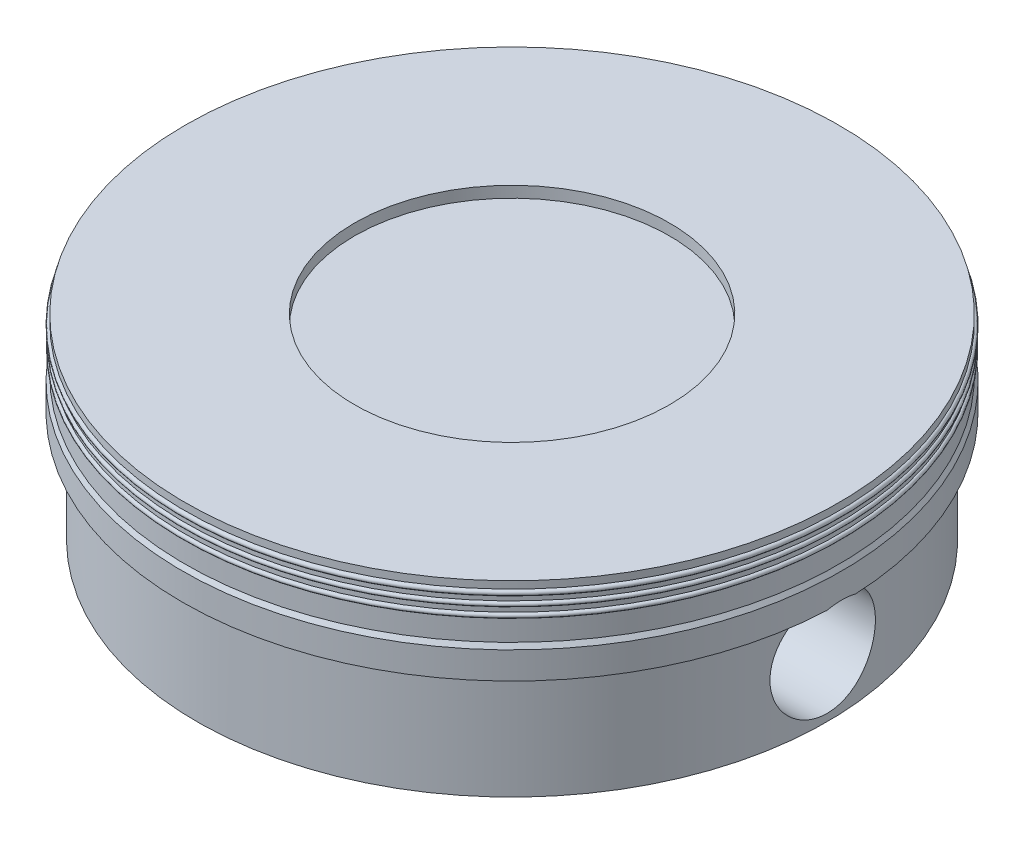
ISO-10303-21;
HEADER;
FILE_DESCRIPTION(('STEP AP214'),'2;1');
FILE_NAME('part.step','',(''),(''),'','','');
FILE_SCHEMA(('AUTOMOTIVE_DESIGN { 1 0 10303 214 1 1 1 1 }'));
ENDSEC;
DATA;
#1=APPLICATION_CONTEXT('core data for automotive mechanical design processes');
#2=APPLICATION_PROTOCOL_DEFINITION('international standard','automotive_design',2000,#1);
#3=PRODUCT_CONTEXT('',#1,'mechanical');
#4=PRODUCT('Part','Part','',(#3));
#5=PRODUCT_RELATED_PRODUCT_CATEGORY('part','',(#4));
#6=PRODUCT_DEFINITION_FORMATION('','',#4);
#7=PRODUCT_DEFINITION_CONTEXT('part definition',#1,'design');
#8=PRODUCT_DEFINITION('design','',#6,#7);
#9=PRODUCT_DEFINITION_SHAPE('','',#8);
#10=(LENGTH_UNIT() NAMED_UNIT(*) SI_UNIT(.MILLI.,.METRE.));
#11=(NAMED_UNIT(*) PLANE_ANGLE_UNIT() SI_UNIT($,.RADIAN.));
#12=(NAMED_UNIT(*) SI_UNIT($,.STERADIAN.) SOLID_ANGLE_UNIT());
#13=UNCERTAINTY_MEASURE_WITH_UNIT(LENGTH_MEASURE(1.E-05),#10,'distance_accuracy_value','');
#14=(GEOMETRIC_REPRESENTATION_CONTEXT(3) GLOBAL_UNCERTAINTY_ASSIGNED_CONTEXT((#13)) GLOBAL_UNIT_ASSIGNED_CONTEXT((#10,
#11,#12)) REPRESENTATION_CONTEXT('',''));
#15=CARTESIAN_POINT('',(0.,0.,0.));
#16=DIRECTION('',(0.,0.,1.));
#17=DIRECTION('',(1.,0.,0.));
#18=AXIS2_PLACEMENT_3D('',#15,#16,#17);
#19=CARTESIAN_POINT('',(5.,1.68,0.));
#20=DIRECTION('',(0.,1.,0.));
#21=DIRECTION('',(-1.,0.,0.));
#22=AXIS2_PLACEMENT_3D('',#19,#20,#21);
#23=PLANE('',#22);
#24=CARTESIAN_POINT('',(0.,1.68000000000002,0.));
#25=DIRECTION('',(0.,1.,0.));
#26=DIRECTION('',(-1.,0.,0.));
#27=AXIS2_PLACEMENT_3D('',#24,#25,#26);
#28=CIRCLE('',#27,5.);
#29=CARTESIAN_POINT('',(-4.99528777949779,1.68000000000003,0.217025344142001));
#30=VERTEX_POINT('',#29);
#31=CARTESIAN_POINT('',(4.9952877794978,1.68000000000002,0.217025344142001));
#32=VERTEX_POINT('',#31);
#33=EDGE_CURVE('E131',#30,#32,#28,.T.);
#34=ORIENTED_EDGE('',*,*,#33,.F.);
#35=DIRECTION('',(1.,0.,0.));
#36=VECTOR('',#35,1.);
#37=CARTESIAN_POINT('',(-5.00031358215678,1.68000000000003,0.217025344142002));
#38=LINE('',#37,#36);
#39=CARTESIAN_POINT('',(-4.77507068010516,1.68000000000001,0.217025344142002));
#40=VERTEX_POINT('',#39);
#41=EDGE_CURVE('E59',#30,#40,#38,.T.);
#42=ORIENTED_EDGE('',*,*,#41,.T.);
#43=CARTESIAN_POINT('',(0.,1.68000000000001,0.));
#44=DIRECTION('',(0.,1.,0.));
#45=DIRECTION('',(-1.,0.,0.));
#46=AXIS2_PLACEMENT_3D('',#43,#44,#45);
#47=CIRCLE('',#46,4.78);
#48=CARTESIAN_POINT('',(4.77507068010517,1.68000000000001,0.217025344142002));
#49=VERTEX_POINT('',#48);
#50=EDGE_CURVE('E139',#40,#49,#47,.T.);
#51=ORIENTED_EDGE('',*,*,#50,.T.);
#52=EDGE_CURVE('E259',#49,#32,#38,.T.);
#53=ORIENTED_EDGE('',*,*,#52,.T.);
#54=EDGE_LOOP('',(#34,#42,#51,#53));
#55=FACE_BOUND('',#54,.T.);
#56=ADVANCED_FACE('F35',(#55),#23,.F.);
#57=CARTESIAN_POINT('',(0.,3.,0.));
#58=DIRECTION('',(0.,1.,0.));
#59=DIRECTION('',(-1.,0.,0.));
#60=AXIS2_PLACEMENT_3D('',#57,#58,#59);
#61=CYLINDRICAL_SURFACE('',#60,3.43);
#62=CARTESIAN_POINT('',(0.,1.93000000000001,0.));
#63=DIRECTION('',(0.,1.,0.));
#64=DIRECTION('',(-1.,0.,0.));
#65=AXIS2_PLACEMENT_3D('',#62,#63,#64);
#66=CIRCLE('',#65,3.42999999999999);
#67=CARTESIAN_POINT('',(-1.74999999999999,1.93000000000002,2.94998305079876));
#68=VERTEX_POINT('',#67);
#69=CARTESIAN_POINT('',(1.75,1.93000000000002,2.94998305079877));
#70=VERTEX_POINT('',#69);
#71=EDGE_CURVE('E173',#68,#70,#66,.T.);
#72=ORIENTED_EDGE('',*,*,#71,.T.);
#73=DIRECTION('',(0.,1.,0.));
#74=VECTOR('',#73,1.);
#75=CARTESIAN_POINT('',(1.75000000000001,3.,2.94998305079876));
#76=LINE('',#75,#74);
#77=CARTESIAN_POINT('',(1.75,0.,2.94998305079877));
#78=VERTEX_POINT('',#77);
#79=EDGE_CURVE('E11',#70,#78,#76,.F.);
#80=ORIENTED_EDGE('',*,*,#79,.T.);
#81=CARTESIAN_POINT('',(0.,0.,0.));
#82=DIRECTION('',(0.,1.,0.));
#83=DIRECTION('',(-1.,0.,0.));
#84=AXIS2_PLACEMENT_3D('',#81,#82,#83);
#85=CIRCLE('',#84,3.43);
#86=CARTESIAN_POINT('',(-1.75,0.,2.94998305079877));
#87=VERTEX_POINT('',#86);
#88=EDGE_CURVE('E174',#87,#78,#85,.T.);
#89=ORIENTED_EDGE('',*,*,#88,.F.);
#90=DIRECTION('',(0.,1.,0.));
#91=VECTOR('',#90,1.);
#92=CARTESIAN_POINT('',(-1.74999999999999,3.00000000000001,2.94998305079876));
#93=LINE('',#92,#91);
#94=EDGE_CURVE('E145',#87,#68,#93,.T.);
#95=ORIENTED_EDGE('',*,*,#94,.T.);
#96=EDGE_LOOP('',(#72,#80,#89,#95));
#97=FACE_BOUND('',#96,.T.);
#98=ADVANCED_FACE('F231',(#97),#61,.F.);
#99=CARTESIAN_POINT('',(4.78,0.,0.));
#100=DIRECTION('',(0.,1.,0.));
#101=DIRECTION('',(-1.,0.,0.));
#102=AXIS2_PLACEMENT_3D('',#99,#100,#101);
#103=PLANE('',#102);
#104=CARTESIAN_POINT('',(0.,0.,0.));
#105=DIRECTION('',(0.,1.,0.));
#106=DIRECTION('',(-1.,0.,0.));
#107=AXIS2_PLACEMENT_3D('',#104,#105,#106);
#108=CIRCLE('',#107,4.78);
#109=CARTESIAN_POINT('',(-4.78,0.,0.));
#110=VERTEX_POINT('',#109);
#111=EDGE_CURVE('E142',#110,#110,#108,.T.);
#112=ORIENTED_EDGE('',*,*,#111,.F.);
#113=EDGE_LOOP('',(#112));
#114=FACE_BOUND('',#113,.T.);
#115=ORIENTED_EDGE('',*,*,#88,.T.);
#116=DIRECTION('',(0.,0.,-1.));
#117=VECTOR('',#116,1.);
#118=CARTESIAN_POINT('',(1.75,0.,2.94998305079877));
#119=LINE('',#118,#117);
#120=CARTESIAN_POINT('',(1.75,0.,-2.94998305079877));
#121=VERTEX_POINT('',#120);
#122=EDGE_CURVE('E258',#78,#121,#119,.T.);
#123=ORIENTED_EDGE('',*,*,#122,.T.);
#124=CARTESIAN_POINT('',(-1.75,0.,-2.94998305079877));
#125=VERTEX_POINT('',#124);
#126=EDGE_CURVE('E158',#121,#125,#85,.T.);
#127=ORIENTED_EDGE('',*,*,#126,.T.);
#128=DIRECTION('',(0.,0.,1.));
#129=VECTOR('',#128,1.);
#130=CARTESIAN_POINT('',(-1.75,0.,2.94998305079877));
#131=LINE('',#130,#129);
#132=EDGE_CURVE('E292',#125,#87,#131,.T.);
#133=ORIENTED_EDGE('',*,*,#132,.T.);
#134=EDGE_LOOP('',(#115,#123,#127,#133));
#135=FACE_BOUND('',#134,.T.);
#136=ADVANCED_FACE('F37',(#114,#135),#103,.F.);
#137=CARTESIAN_POINT('',(0.,3.,0.));
#138=DIRECTION('',(0.,1.,0.));
#139=DIRECTION('',(-1.,0.,0.));
#140=AXIS2_PLACEMENT_3D('',#137,#138,#139);
#141=CYLINDRICAL_SURFACE('',#140,4.78);
#142=ORIENTED_EDGE('',*,*,#50,.F.);
#143=CARTESIAN_POINT('',(-4.77507068010516,1.68000000000001,0.217025344142004));
#144=CARTESIAN_POINT('',(-4.77311674454233,1.66781545501288,0.260389997840815));
#145=CARTESIAN_POINT('',(-4.77058685151336,1.65191421075666,0.302658617409352));
#146=CARTESIAN_POINT('',(-4.76473120839085,1.61331601743291,0.383861318073861));
#147=CARTESIAN_POINT('',(-4.76140626252574,1.59062592976741,0.422798715140706));
#148=CARTESIAN_POINT('',(-4.75431061348991,1.53905634512329,0.496294501252141));
#149=CARTESIAN_POINT('',(-4.75053983511395,1.51017580323829,0.530852149456086));
#150=CARTESIAN_POINT('',(-4.74297703732711,1.44704123469802,0.594642145847093));
#151=CARTESIAN_POINT('',(-4.73918501905321,1.41278749307186,0.623874776329725));
#152=CARTESIAN_POINT('',(-4.73198231554192,1.33963445348552,0.676351887298021));
#153=CARTESIAN_POINT('',(-4.72857386348334,1.30071042802215,0.699562233458827));
#154=CARTESIAN_POINT('',(-4.722554449733,1.21945126202547,0.739108544642549));
#155=CARTESIAN_POINT('',(-4.7199435335669,1.17711592693901,0.755444117253613));
#156=CARTESIAN_POINT('',(-4.71583989573606,1.09055475865294,0.780651928805549));
#157=CARTESIAN_POINT('',(-4.71433931182688,1.04634460825855,0.78957669968297));
#158=CARTESIAN_POINT('',(-4.71260225277348,0.957032751672894,0.799880045235935));
#159=CARTESIAN_POINT('',(-4.71236561191706,0.911931163133967,0.801259609143973));
#160=CARTESIAN_POINT('',(-4.71317900815313,0.822677727153119,0.796460213173493));
#161=CARTESIAN_POINT('',(-4.71421397175651,0.778520946037548,0.790369803192609));
#162=CARTESIAN_POINT('',(-4.71742577664519,0.691867355104276,0.770966694821888));
#163=CARTESIAN_POINT('',(-4.71960265705314,0.649370602213579,0.757653748983807));
#164=CARTESIAN_POINT('',(-4.72485660636635,0.567130603972325,0.724165813365873));
#165=CARTESIAN_POINT('',(-4.72793556010962,0.527393341700227,0.703976441127917));
#166=CARTESIAN_POINT('',(-4.73464750015665,0.451846186290663,0.657317733090343));
#167=CARTESIAN_POINT('',(-4.73828052890579,0.416036594397316,0.630847916085545));
#168=CARTESIAN_POINT('',(-4.74574814670545,0.348880399682957,0.571982147608487));
#169=CARTESIAN_POINT('',(-4.74958470463594,0.317596008918088,0.539515441920811));
#170=CARTESIAN_POINT('',(-4.75698830468752,0.260900716431982,0.46977620029005));
#171=CARTESIAN_POINT('',(-4.76055533948056,0.235489974370328,0.43250353375254));
#172=CARTESIAN_POINT('',(-4.76703400126185,0.191183550664448,0.354034042364138));
#173=CARTESIAN_POINT('',(-4.76994321603746,0.172311716637733,0.312823538628481));
#174=CARTESIAN_POINT('',(-4.77476061322142,0.141776205047524,0.227758381570003));
#175=CARTESIAN_POINT('',(-4.7766688734147,0.130111967363595,0.18390393400549));
#176=CARTESIAN_POINT('',(-4.77925311923534,0.114437264129429,0.0953004936422028));
#177=CARTESIAN_POINT('',(-4.77994216086845,0.110345684668128,0.0505662307843724));
#178=CARTESIAN_POINT('',(-4.78005079027309,0.109696432804755,-0.0389570033490249));
#179=CARTESIAN_POINT('',(-4.7794704468681,0.113138351951772,-0.0837459715269927));
#180=CARTESIAN_POINT('',(-4.77711565664269,0.127387693539052,-0.171718625850081));
#181=CARTESIAN_POINT('',(-4.77535116971636,0.138133690579949,-0.214912556661749));
#182=CARTESIAN_POINT('',(-4.77083222456877,0.166604814851211,-0.298879816869673));
#183=CARTESIAN_POINT('',(-4.76807772295138,0.184330248020241,-0.339653040065744));
#184=CARTESIAN_POINT('',(-4.76185735284646,0.226392438799229,-0.417933619716623));
#185=CARTESIAN_POINT('',(-4.75838675692455,0.25077349929395,-0.455416783633542));
#186=CARTESIAN_POINT('',(-4.75112593986705,0.305410165362624,-0.525790773700051));
#187=CARTESIAN_POINT('',(-4.74733569379902,0.335666229421933,-0.558681241090935));
#188=CARTESIAN_POINT('',(-4.73980727708293,0.401614121406352,-0.619333370466636));
#189=CARTESIAN_POINT('',(-4.73607022605573,0.43736511967987,-0.647030880030757));
#190=CARTESIAN_POINT('',(-4.72911708259974,0.51305406965723,-0.696036212012226));
#191=CARTESIAN_POINT('',(-4.72590098778355,0.552992002172106,-0.717344063712027));
#192=CARTESIAN_POINT('',(-4.72036394830086,0.635881027755302,-0.752920794222738));
#193=CARTESIAN_POINT('',(-4.71804171930698,0.678827692065076,-0.76719978056631));
#194=CARTESIAN_POINT('',(-4.71455803308112,0.766555057162836,-0.788326469780885));
#195=CARTESIAN_POINT('',(-4.71339644749025,0.811335554571616,-0.79517499441518));
#196=CARTESIAN_POINT('',(-4.71237792548226,0.900855119314705,-0.801188832970665));
#197=CARTESIAN_POINT('',(-4.71250471630899,0.945587583461799,-0.800449977549891));
#198=CARTESIAN_POINT('',(-4.71400893661549,1.03428625093352,-0.791542596891857));
#199=CARTESIAN_POINT('',(-4.71538641020498,1.07825242717657,-0.783373809611914));
#200=CARTESIAN_POINT('',(-4.71922515448501,1.16399796218288,-0.759903429890679));
#201=CARTESIAN_POINT('',(-4.72168213100791,1.2057852589045,-0.744630084761267));
#202=CARTESIAN_POINT('',(-4.72740111237164,1.28620740457153,-0.707411877504164));
#203=CARTESIAN_POINT('',(-4.73066306052801,1.32484247523545,-0.685467485112741));
#204=CARTESIAN_POINT('',(-4.73766913754594,1.3983268405387,-0.635246489063856));
#205=CARTESIAN_POINT('',(-4.7414181117624,1.4331305371531,-0.606903797016715));
#206=CARTESIAN_POINT('',(-4.74895324518949,1.49752173812273,-0.544812975714236));
#207=CARTESIAN_POINT('',(-4.75273941333656,1.52710795484903,-0.511063516026395));
#208=CARTESIAN_POINT('',(-4.76019658054343,1.58221567707852,-0.436382904178712));
#209=CARTESIAN_POINT('',(-4.76383860975077,1.60727795424228,-0.395106051997348));
#210=CARTESIAN_POINT('',(-4.76862414691184,1.63903057077709,-0.330299567260993));
#211=CARTESIAN_POINT('',(-4.77010793138987,1.64865021484141,-0.308184135262309));
#212=CARTESIAN_POINT('',(-4.77280388719458,1.66586173783492,-0.263159914490926));
#213=CARTESIAN_POINT('',(-4.77401603731461,1.67345345845175,-0.240251063936636));
#214=CARTESIAN_POINT('',(-4.77507068010516,1.68000000000003,-0.217025344142013));
#215=B_SPLINE_CURVE_WITH_KNOTS('',3,(#143,#144,#145,#146,#147,#148,#149,#150,#151,#152,#153,
#154,#155,#156,#157,#158,#159,#160,#161,#162,#163,#164,#165,#166,#167,#168,#169,#170,#171,#172,
#173,#174,#175,#176,#177,#178,#179,#180,#181,#182,#183,#184,#185,#186,#187,#188,#189,#190,#191,
#192,#193,#194,#195,#196,#197,#198,#199,#200,#201,#202,#203,#204,#205,#206,#207,#208,#209,#210,
#211,#212,#213,#214),.UNSPECIFIED.,.F.,.F.,(4,2,2,2,2,2,2,2,2,2,2,2,2,2,2,2,2,2,2,2,2,2,2,2,2,2,
2,2,2,2,2,2,2,2,2,4),(0.,0.135061280341501,0.269986514358777,0.404934540793561,
0.539875411135064,0.675565195916626,0.811262724816585,0.945989937250953,1.08069948552684,
1.21382749053972,1.34696005688289,1.48037280557488,1.61379577960146,1.7489071731124,
1.88402223883692,2.01962501133352,2.15521724447197,2.28934849434868,2.42347247208309,
2.556482234058,2.68949782707129,2.82342138218051,2.95735539288927,3.09284832298828,
3.22834063214233,3.36363752953,3.49891946238859,3.63249487099912,3.76607499079898,
3.89912848475602,4.03217261203068,4.16665952396068,4.30117957979025,4.4455970880262,
4.51799903529635,4.59040663306343),.UNSPECIFIED.);
#216=CARTESIAN_POINT('',(-4.77507068010516,1.68000000000001,-0.217025344142002));
#217=VERTEX_POINT('',#216);
#218=EDGE_CURVE('E242',#40,#217,#215,.T.);
#219=ORIENTED_EDGE('',*,*,#218,.T.);
#220=CARTESIAN_POINT('',(4.77507068010517,1.68000000000001,-0.217025344142002));
#221=VERTEX_POINT('',#220);
#222=EDGE_CURVE('E127',#221,#217,#47,.T.);
#223=ORIENTED_EDGE('',*,*,#222,.F.);
#224=CARTESIAN_POINT('',(4.77507068010517,1.68000000000001,-0.217025344142004));
#225=CARTESIAN_POINT('',(4.77311674454234,1.66781545501288,-0.260389997840815));
#226=CARTESIAN_POINT('',(4.77058685151337,1.65191421075666,-0.302658617409352));
#227=CARTESIAN_POINT('',(4.76473120839086,1.61331601743291,-0.383861318073861));
#228=CARTESIAN_POINT('',(4.76140626252575,1.59062592976741,-0.422798715140706));
#229=CARTESIAN_POINT('',(4.75431061348992,1.53905634512329,-0.496294501252141));
#230=CARTESIAN_POINT('',(4.75053983511396,1.51017580323829,-0.530852149456086));
#231=CARTESIAN_POINT('',(4.74297703732711,1.44704123469802,-0.594642145847093));
#232=CARTESIAN_POINT('',(4.73918501905321,1.41278749307186,-0.623874776329725));
#233=CARTESIAN_POINT('',(4.73198231554193,1.33963445348552,-0.676351887298021));
#234=CARTESIAN_POINT('',(4.72857386348335,1.30071042802215,-0.699562233458827));
#235=CARTESIAN_POINT('',(4.72255444973301,1.21945126202547,-0.739108544642549));
#236=CARTESIAN_POINT('',(4.71994353356691,1.17711592693901,-0.755444117253613));
#237=CARTESIAN_POINT('',(4.71583989573606,1.09055475865294,-0.780651928805549));
#238=CARTESIAN_POINT('',(4.71433931182688,1.04634460825855,-0.78957669968297));
#239=CARTESIAN_POINT('',(4.71260225277348,0.957032751672894,-0.799880045235935));
#240=CARTESIAN_POINT('',(4.71236561191707,0.911931163133967,-0.801259609143973));
#241=CARTESIAN_POINT('',(4.71317900815314,0.822677727153119,-0.796460213173493));
#242=CARTESIAN_POINT('',(4.71421397175652,0.778520946037547,-0.790369803192609));
#243=CARTESIAN_POINT('',(4.7174257766452,0.691867355104275,-0.770966694821888));
#244=CARTESIAN_POINT('',(4.71960265705314,0.649370602213578,-0.757653748983807));
#245=CARTESIAN_POINT('',(4.72485660636635,0.567130603972325,-0.724165813365873));
#246=CARTESIAN_POINT('',(4.72793556010963,0.527393341700227,-0.703976441127917));
#247=CARTESIAN_POINT('',(4.73464750015666,0.451846186290663,-0.657317733090343));
#248=CARTESIAN_POINT('',(4.73828052890579,0.416036594397316,-0.630847916085544));
#249=CARTESIAN_POINT('',(4.74574814670545,0.348880399682957,-0.571982147608487));
#250=CARTESIAN_POINT('',(4.74958470463594,0.317596008918088,-0.539515441920811));
#251=CARTESIAN_POINT('',(4.75698830468752,0.260900716431982,-0.46977620029005));
#252=CARTESIAN_POINT('',(4.76055533948056,0.235489974370328,-0.43250353375254));
#253=CARTESIAN_POINT('',(4.76703400126185,0.191183550664448,-0.354034042364138));
#254=CARTESIAN_POINT('',(4.76994321603746,0.172311716637733,-0.31282353862848));
#255=CARTESIAN_POINT('',(4.77476061322142,0.141776205047524,-0.227758381570003));
#256=CARTESIAN_POINT('',(4.7766688734147,0.130111967363595,-0.18390393400549));
#257=CARTESIAN_POINT('',(4.77925311923534,0.114437264129429,-0.0953004936422031));
#258=CARTESIAN_POINT('',(4.77994216086845,0.110345684668128,-0.0505662307843727));
#259=CARTESIAN_POINT('',(4.78005079027309,0.109696432804754,0.0389570033490246));
#260=CARTESIAN_POINT('',(4.7794704468681,0.113138351951772,0.0837459715269926));
#261=CARTESIAN_POINT('',(4.77711565664269,0.127387693539052,0.171718625850081));
#262=CARTESIAN_POINT('',(4.77535116971636,0.138133690579949,0.214912556661749));
#263=CARTESIAN_POINT('',(4.77083222456877,0.166604814851211,0.298879816869673));
#264=CARTESIAN_POINT('',(4.76807772295138,0.184330248020242,0.339653040065745));
#265=CARTESIAN_POINT('',(4.76185735284646,0.226392438799229,0.417933619716624));
#266=CARTESIAN_POINT('',(4.75838675692455,0.25077349929395,0.455416783633543));
#267=CARTESIAN_POINT('',(4.75112593986705,0.305410165362624,0.525790773700052));
#268=CARTESIAN_POINT('',(4.74733569379903,0.335666229421933,0.558681241090935));
#269=CARTESIAN_POINT('',(4.73980727708293,0.401614121406352,0.619333370466636));
#270=CARTESIAN_POINT('',(4.73607022605573,0.437365119679871,0.647030880030757));
#271=CARTESIAN_POINT('',(4.72911708259975,0.513054069657231,0.696036212012227));
#272=CARTESIAN_POINT('',(4.72590098778356,0.552992002172107,0.717344063712027));
#273=CARTESIAN_POINT('',(4.72036394830086,0.635881027755302,0.752920794222738));
#274=CARTESIAN_POINT('',(4.71804171930699,0.678827692065076,0.76719978056631));
#275=CARTESIAN_POINT('',(4.71455803308113,0.766555057162836,0.788326469780885));
#276=CARTESIAN_POINT('',(4.71339644749025,0.811335554571617,0.79517499441518));
#277=CARTESIAN_POINT('',(4.71237792548226,0.900855119314706,0.801188832970665));
#278=CARTESIAN_POINT('',(4.712504716309,0.9455875834618,0.800449977549891));
#279=CARTESIAN_POINT('',(4.7140089366155,1.03428625093352,0.791542596891857));
#280=CARTESIAN_POINT('',(4.71538641020498,1.07825242717657,0.783373809611914));
#281=CARTESIAN_POINT('',(4.71922515448502,1.16399796218288,0.759903429890678));
#282=CARTESIAN_POINT('',(4.72168213100792,1.2057852589045,0.744630084761267));
#283=CARTESIAN_POINT('',(4.72740111237164,1.28620740457153,0.707411877504163));
#284=CARTESIAN_POINT('',(4.73066306052801,1.32484247523545,0.685467485112741));
#285=CARTESIAN_POINT('',(4.73766913754595,1.3983268405387,0.635246489063856));
#286=CARTESIAN_POINT('',(4.74141811176241,1.4331305371531,0.606903797016715));
#287=CARTESIAN_POINT('',(4.74895324518949,1.49752173812273,0.544812975714235));
#288=CARTESIAN_POINT('',(4.75273941333656,1.52710795484903,0.511063516026395));
#289=CARTESIAN_POINT('',(4.76019658054344,1.58221567707852,0.436382904178711));
#290=CARTESIAN_POINT('',(4.76383860975078,1.60727795424228,0.395106051997347));
#291=CARTESIAN_POINT('',(4.76862414691185,1.63903057077709,0.330299567260993));
#292=CARTESIAN_POINT('',(4.77010793138987,1.64865021484141,0.308184135262309));
#293=CARTESIAN_POINT('',(4.77280388719459,1.66586173783492,0.263159914490926));
#294=CARTESIAN_POINT('',(4.77401603731462,1.67345345845175,0.240251063936636));
#295=CARTESIAN_POINT('',(4.77507068010517,1.68000000000003,0.217025344142013));
#296=B_SPLINE_CURVE_WITH_KNOTS('',3,(#224,#225,#226,#227,#228,#229,#230,#231,#232,#233,#234,
#235,#236,#237,#238,#239,#240,#241,#242,#243,#244,#245,#246,#247,#248,#249,#250,#251,#252,#253,
#254,#255,#256,#257,#258,#259,#260,#261,#262,#263,#264,#265,#266,#267,#268,#269,#270,#271,#272,
#273,#274,#275,#276,#277,#278,#279,#280,#281,#282,#283,#284,#285,#286,#287,#288,#289,#290,#291,
#292,#293,#294,#295),.UNSPECIFIED.,.F.,.F.,(4,2,2,2,2,2,2,2,2,2,2,2,2,2,2,2,2,2,2,2,2,2,2,2,2,2,
2,2,2,2,2,2,2,2,2,4),(0.,0.135061280341501,0.269986514358777,0.404934540793561,
0.539875411135064,0.675565195916627,0.811262724816586,0.945989937250954,1.08069948552684,
1.21382749053972,1.34696005688289,1.48037280557488,1.61379577960146,1.7489071731124,
1.88402223883692,2.01962501133352,2.15521724447197,2.28934849434868,2.42347247208309,
2.556482234058,2.68949782707129,2.82342138218051,2.95735539288927,3.09284832298828,
3.22834063214233,3.36363752953,3.49891946238859,3.63249487099912,3.76607499079898,
3.89912848475602,4.03217261203068,4.16665952396068,4.30117957979025,4.4455970880262,
4.51799903529634,4.59040663306343),.UNSPECIFIED.);
#297=EDGE_CURVE('E251',#221,#49,#296,.T.);
#298=ORIENTED_EDGE('',*,*,#297,.T.);
#299=EDGE_LOOP('',(#142,#219,#223,#298));
#300=FACE_BOUND('',#299,.T.);
#301=ORIENTED_EDGE('',*,*,#111,.T.);
#302=EDGE_LOOP('',(#301));
#303=FACE_BOUND('',#302,.T.);
#304=ADVANCED_FACE('F227',(#300,#303),#141,.T.);
#305=CARTESIAN_POINT('',(4.9952877794978,1.68,-0.217025344142001));
#306=VERTEX_POINT('',#305);
#307=CARTESIAN_POINT('',(-4.99528777949779,1.68000000000002,-0.217025344142001));
#308=VERTEX_POINT('',#307);
#309=EDGE_CURVE('E125',#306,#308,#28,.T.);
#310=ORIENTED_EDGE('',*,*,#309,.F.);
#311=DIRECTION('',(1.,0.,0.));
#312=VECTOR('',#311,1.);
#313=CARTESIAN_POINT('',(-5.00031358215678,1.68000000000003,-0.217025344142002));
#314=LINE('',#313,#312);
#315=EDGE_CURVE('E51',#306,#221,#314,.F.);
#316=ORIENTED_EDGE('',*,*,#315,.T.);
#317=ORIENTED_EDGE('',*,*,#222,.T.);
#318=EDGE_CURVE('E113',#217,#308,#314,.F.);
#319=ORIENTED_EDGE('',*,*,#318,.T.);
#320=EDGE_LOOP('',(#310,#316,#317,#319));
#321=FACE_BOUND('',#320,.T.);
#322=ADVANCED_FACE('F124',(#321),#23,.F.);
#323=CARTESIAN_POINT('',(0.,3.,0.));
#324=DIRECTION('',(0.,1.,0.));
#325=DIRECTION('',(-1.,0.,0.));
#326=AXIS2_PLACEMENT_3D('',#323,#324,#325);
#327=CYLINDRICAL_SURFACE('',#326,4.99999999999999);
#328=CARTESIAN_POINT('',(0.,2.09000000000001,0.));
#329=DIRECTION('',(0.,1.,0.));
#330=DIRECTION('',(-1.,0.,0.));
#331=AXIS2_PLACEMENT_3D('',#328,#329,#330);
#332=CIRCLE('',#331,4.99999999999999);
#333=CARTESIAN_POINT('',(-4.99999999999999,2.09000000000003,0.));
#334=VERTEX_POINT('',#333);
#335=EDGE_CURVE('E132',#334,#334,#332,.T.);
#336=ORIENTED_EDGE('',*,*,#335,.F.);
#337=EDGE_LOOP('',(#336));
#338=FACE_BOUND('',#337,.T.);
#339=ORIENTED_EDGE('',*,*,#33,.T.);
#340=CARTESIAN_POINT('',(4.9952877794978,1.68000000000002,0.217025344142001));
#341=CARTESIAN_POINT('',(4.9962289677488,1.6861010605893,0.195376542677263));
#342=CARTESIAN_POINT('',(4.99703852701703,1.69128766111014,0.173477485347938));
#343=CARTESIAN_POINT('',(4.99837648438901,1.69980153137874,0.129307503830391));
#344=CARTESIAN_POINT('',(4.99890482030151,1.70312838986115,0.107036498509726));
#345=CARTESIAN_POINT('',(5.00002251450322,1.71015664531778,0.0409416851131565));
#346=CARTESIAN_POINT('',(5.00019087516558,1.71119783067905,-0.0032103965264131));
#347=CARTESIAN_POINT('',(4.99950986075141,1.70693153463768,-0.075630858228989));
#348=CARTESIAN_POINT('',(4.99899604063541,1.70371836424205,-0.10405037735725));
#349=CARTESIAN_POINT('',(4.99749606245128,1.69420881985101,-0.160800504746136));
#350=CARTESIAN_POINT('',(4.99650285198295,1.68786637859661,-0.189123213080441));
#351=CARTESIAN_POINT('',(4.9952877794978,1.68000000000003,-0.217025344142001));
#352=B_SPLINE_CURVE_WITH_KNOTS('',3,(#340,#341,#342,#343,#344,#345,#346,#347,#348,#349,#350,
#351),.UNSPECIFIED.,.F.,.F.,(4,2,2,2,2,4),(0.,0.0674894445675057,0.13499380792442,
0.266780752005557,0.352446419941768,0.439412626048291),.UNSPECIFIED.);
#353=EDGE_CURVE('E130',#32,#306,#352,.T.);
#354=ORIENTED_EDGE('',*,*,#353,.T.);
#355=ORIENTED_EDGE('',*,*,#309,.T.);
#356=CARTESIAN_POINT('',(-4.99528777949779,1.68000000000002,-0.217025344142001));
#357=CARTESIAN_POINT('',(-4.99622896774879,1.6861010605893,-0.195376542677263));
#358=CARTESIAN_POINT('',(-4.99703852701702,1.69128766111014,-0.173477485347938));
#359=CARTESIAN_POINT('',(-4.998376484389,1.69980153137874,-0.129307503830391));
#360=CARTESIAN_POINT('',(-4.9989048203015,1.70312838986115,-0.107036498509726));
#361=CARTESIAN_POINT('',(-5.00002251450321,1.71015664531778,-0.0409416851131563));
#362=CARTESIAN_POINT('',(-5.00019087516557,1.71119783067905,0.00321039652641335));
#363=CARTESIAN_POINT('',(-4.9995098607514,1.70693153463768,0.0756308582289893));
#364=CARTESIAN_POINT('',(-4.9989960406354,1.70371836424205,0.104050377357251));
#365=CARTESIAN_POINT('',(-4.99749606245127,1.69420881985101,0.160800504746136));
#366=CARTESIAN_POINT('',(-4.99650285198294,1.68786637859661,0.189123213080441));
#367=CARTESIAN_POINT('',(-4.99528777949779,1.68000000000003,0.217025344142001));
#368=B_SPLINE_CURVE_WITH_KNOTS('',3,(#356,#357,#358,#359,#360,#361,#362,#363,#364,#365,#366,
#367),.UNSPECIFIED.,.F.,.F.,(4,2,2,2,2,4),(0.,0.0674894445675057,0.134993807924421,
0.266780752005558,0.352446419941768,0.43941262604829),.UNSPECIFIED.);
#369=EDGE_CURVE('E110',#308,#30,#368,.T.);
#370=ORIENTED_EDGE('',*,*,#369,.T.);
#371=EDGE_LOOP('',(#339,#354,#355,#370));
#372=FACE_BOUND('',#371,.T.);
#373=ADVANCED_FACE('F129',(#338,#372),#327,.T.);
#374=CARTESIAN_POINT('',(0.,2.09000000000001,0.));
#375=DIRECTION('',(0.,-1.,0.));
#376=DIRECTION('',(1.,0.,0.));
#377=AXIS2_PLACEMENT_3D('',#374,#375,#376);
#378=CONICAL_SURFACE('',#377,4.99999999999999,0.519146114246532);
#379=CARTESIAN_POINT('',(0.,2.16000000000001,0.));
#380=DIRECTION('',(0.,1.,0.));
#381=DIRECTION('',(-1.,0.,0.));
#382=AXIS2_PLACEMENT_3D('',#379,#380,#381);
#383=CIRCLE('',#382,4.95999999999999);
#384=CARTESIAN_POINT('',(-4.95999999999999,2.16000000000003,0.));
#385=VERTEX_POINT('',#384);
#386=EDGE_CURVE('E135',#385,#385,#383,.T.);
#387=ORIENTED_EDGE('',*,*,#386,.F.);
#388=EDGE_LOOP('',(#387));
#389=FACE_BOUND('',#388,.T.);
#390=ORIENTED_EDGE('',*,*,#335,.T.);
#391=EDGE_LOOP('',(#390));
#392=FACE_BOUND('',#391,.T.);
#393=ADVANCED_FACE('F216',(#389,#392),#378,.T.);
#394=CARTESIAN_POINT('',(0.,3.,0.));
#395=DIRECTION('',(0.,1.,0.));
#396=DIRECTION('',(-1.,0.,0.));
#397=AXIS2_PLACEMENT_3D('',#394,#395,#396);
#398=CYLINDRICAL_SURFACE('',#397,4.95999999999999);
#399=CARTESIAN_POINT('',(0.,2.48362028805575,0.));
#400=DIRECTION('',(0.,1.,0.));
#401=DIRECTION('',(-1.,0.,0.));
#402=AXIS2_PLACEMENT_3D('',#399,#400,#401);
#403=CIRCLE('',#402,4.95999999999999);
#404=CARTESIAN_POINT('',(-4.95999999999998,2.48362028805576,0.));
#405=VERTEX_POINT('',#404);
#406=EDGE_CURVE('E209',#405,#405,#403,.T.);
#407=ORIENTED_EDGE('',*,*,#406,.F.);
#408=EDGE_LOOP('',(#407));
#409=FACE_BOUND('',#408,.T.);
#410=ORIENTED_EDGE('',*,*,#386,.T.);
#411=EDGE_LOOP('',(#410));
#412=FACE_BOUND('',#411,.T.);
#413=ADVANCED_FACE('F214',(#409,#412),#398,.T.);
#414=CARTESIAN_POINT('',(0.,2.52000000000001,0.));
#415=DIRECTION('',(0.,1.,0.));
#416=DIRECTION('',(-1.,0.,0.));
#417=AXIS2_PLACEMENT_3D('',#414,#415,#416);
#418=TOROIDAL_SURFACE('',#417,4.95999999999999,0.0363797119442648);
#419=CARTESIAN_POINT('',(0.,2.55637971194428,0.));
#420=DIRECTION('',(0.,1.,0.));
#421=DIRECTION('',(-1.,0.,0.));
#422=AXIS2_PLACEMENT_3D('',#419,#420,#421);
#423=CIRCLE('',#422,4.95999999999999);
#424=CARTESIAN_POINT('',(-4.95999999999998,2.55637971194429,0.));
#425=VERTEX_POINT('',#424);
#426=EDGE_CURVE('E206',#425,#425,#423,.T.);
#427=ORIENTED_EDGE('',*,*,#426,.F.);
#428=EDGE_LOOP('',(#427));
#429=FACE_BOUND('',#428,.T.);
#430=ORIENTED_EDGE('',*,*,#406,.T.);
#431=EDGE_LOOP('',(#430));
#432=FACE_BOUND('',#431,.T.);
#433=ADVANCED_FACE('F366',(#429,#432),#418,.T.);
#434=CARTESIAN_POINT('',(0.,3.,0.));
#435=DIRECTION('',(0.,1.,0.));
#436=DIRECTION('',(-1.,0.,0.));
#437=AXIS2_PLACEMENT_3D('',#434,#435,#436);
#438=CYLINDRICAL_SURFACE('',#437,4.95999999999999);
#439=CARTESIAN_POINT('',(0.,2.63484764119514,0.));
#440=DIRECTION('',(0.,1.,0.));
#441=DIRECTION('',(-1.,0.,0.));
#442=AXIS2_PLACEMENT_3D('',#439,#440,#441);
#443=CIRCLE('',#442,4.95999999999999);
#444=CARTESIAN_POINT('',(-4.95999999999998,2.63484764119516,0.));
#445=VERTEX_POINT('',#444);
#446=EDGE_CURVE('E203',#445,#445,#443,.T.);
#447=ORIENTED_EDGE('',*,*,#446,.F.);
#448=EDGE_LOOP('',(#447));
#449=FACE_BOUND('',#448,.T.);
#450=ORIENTED_EDGE('',*,*,#426,.T.);
#451=EDGE_LOOP('',(#450));
#452=FACE_BOUND('',#451,.T.);
#453=ADVANCED_FACE('F362',(#449,#452),#438,.T.);
#454=CARTESIAN_POINT('',(0.,2.67000000000001,0.));
#455=DIRECTION('',(0.,1.,0.));
#456=DIRECTION('',(-1.,0.,0.));
#457=AXIS2_PLACEMENT_3D('',#454,#455,#456);
#458=TOROIDAL_SURFACE('',#457,4.95999999999999,0.0351523588048722);
#459=CARTESIAN_POINT('',(0.,2.70515235880489,0.));
#460=DIRECTION('',(0.,1.,0.));
#461=DIRECTION('',(-1.,0.,0.));
#462=AXIS2_PLACEMENT_3D('',#459,#460,#461);
#463=CIRCLE('',#462,4.95999999999999);
#464=CARTESIAN_POINT('',(-4.95999999999998,2.7051523588049,0.));
#465=VERTEX_POINT('',#464);
#466=EDGE_CURVE('E200',#465,#465,#463,.T.);
#467=ORIENTED_EDGE('',*,*,#466,.F.);
#468=EDGE_LOOP('',(#467));
#469=FACE_BOUND('',#468,.T.);
#470=ORIENTED_EDGE('',*,*,#446,.T.);
#471=EDGE_LOOP('',(#470));
#472=FACE_BOUND('',#471,.T.);
#473=ADVANCED_FACE('F358',(#469,#472),#458,.T.);
#474=CARTESIAN_POINT('',(0.,3.,0.));
#475=DIRECTION('',(0.,1.,0.));
#476=DIRECTION('',(-1.,0.,0.));
#477=AXIS2_PLACEMENT_3D('',#474,#475,#476);
#478=CYLINDRICAL_SURFACE('',#477,4.95999999999999);
#479=CARTESIAN_POINT('',(0.,2.77968641784321,0.));
#480=DIRECTION('',(0.,1.,0.));
#481=DIRECTION('',(-1.,0.,0.));
#482=AXIS2_PLACEMENT_3D('',#479,#480,#481);
#483=CIRCLE('',#482,4.95999999999999);
#484=CARTESIAN_POINT('',(-4.95999999999998,2.77968641784323,0.));
#485=VERTEX_POINT('',#484);
#486=EDGE_CURVE('E197',#485,#485,#483,.T.);
#487=ORIENTED_EDGE('',*,*,#486,.F.);
#488=EDGE_LOOP('',(#487));
#489=FACE_BOUND('',#488,.T.);
#490=ORIENTED_EDGE('',*,*,#466,.T.);
#491=EDGE_LOOP('',(#490));
#492=FACE_BOUND('',#491,.T.);
#493=ADVANCED_FACE('F354',(#489,#492),#478,.T.);
#494=CARTESIAN_POINT('',(0.,2.82000000000001,0.));
#495=DIRECTION('',(0.,1.,0.));
#496=DIRECTION('',(-1.,0.,0.));
#497=AXIS2_PLACEMENT_3D('',#494,#495,#496);
#498=TOROIDAL_SURFACE('',#497,4.95999999999999,0.0403135821568025);
#499=CARTESIAN_POINT('',(0.,2.86031358215682,0.));
#500=DIRECTION('',(0.,1.,0.));
#501=DIRECTION('',(-1.,0.,0.));
#502=AXIS2_PLACEMENT_3D('',#499,#500,#501);
#503=CIRCLE('',#502,4.95999999999999);
#504=CARTESIAN_POINT('',(-4.95999999999998,2.86031358215683,0.));
#505=VERTEX_POINT('',#504);
#506=EDGE_CURVE('E194',#505,#505,#503,.T.);
#507=ORIENTED_EDGE('',*,*,#506,.F.);
#508=EDGE_LOOP('',(#507));
#509=FACE_BOUND('',#508,.T.);
#510=ORIENTED_EDGE('',*,*,#486,.T.);
#511=EDGE_LOOP('',(#510));
#512=FACE_BOUND('',#511,.T.);
#513=ADVANCED_FACE('F350',(#509,#512),#498,.T.);
#514=CARTESIAN_POINT('',(0.,3.,0.));
#515=DIRECTION('',(0.,1.,0.));
#516=DIRECTION('',(-1.,0.,0.));
#517=AXIS2_PLACEMENT_3D('',#514,#515,#516);
#518=CYLINDRICAL_SURFACE('',#517,4.95999999999999);
#519=CARTESIAN_POINT('',(0.,2.97000000000001,0.));
#520=DIRECTION('',(0.,1.,0.));
#521=DIRECTION('',(-1.,0.,0.));
#522=AXIS2_PLACEMENT_3D('',#519,#520,#521);
#523=CIRCLE('',#522,4.95999999999999);
#524=CARTESIAN_POINT('',(-4.95999999999998,2.97000000000003,0.));
#525=VERTEX_POINT('',#524);
#526=EDGE_CURVE('E191',#525,#525,#523,.T.);
#527=ORIENTED_EDGE('',*,*,#526,.F.);
#528=EDGE_LOOP('',(#527));
#529=FACE_BOUND('',#528,.T.);
#530=ORIENTED_EDGE('',*,*,#506,.T.);
#531=EDGE_LOOP('',(#530));
#532=FACE_BOUND('',#531,.T.);
#533=ADVANCED_FACE('F346',(#529,#532),#518,.T.);
#534=CARTESIAN_POINT('',(2.39,2.97,0.));
#535=DIRECTION('',(0.,-1.,0.));
#536=DIRECTION('',(1.,0.,0.));
#537=AXIS2_PLACEMENT_3D('',#534,#535,#536);
#538=PLANE('',#537);
#539=CARTESIAN_POINT('',(0.,2.97000000000001,0.));
#540=DIRECTION('',(0.,1.,0.));
#541=DIRECTION('',(-1.,0.,0.));
#542=AXIS2_PLACEMENT_3D('',#539,#540,#541);
#543=CIRCLE('',#542,2.38999999999999);
#544=CARTESIAN_POINT('',(-2.38999999999998,2.97000000000001,0.));
#545=VERTEX_POINT('',#544);
#546=EDGE_CURVE('E188',#545,#545,#543,.T.);
#547=ORIENTED_EDGE('',*,*,#546,.F.);
#548=EDGE_LOOP('',(#547));
#549=FACE_BOUND('',#548,.T.);
#550=ORIENTED_EDGE('',*,*,#526,.T.);
#551=EDGE_LOOP('',(#550));
#552=FACE_BOUND('',#551,.T.);
#553=ADVANCED_FACE('F342',(#549,#552),#538,.F.);
#554=CARTESIAN_POINT('',(0.,3.,0.));
#555=DIRECTION('',(0.,1.,0.));
#556=DIRECTION('',(-1.,0.,0.));
#557=AXIS2_PLACEMENT_3D('',#554,#555,#556);
#558=CYLINDRICAL_SURFACE('',#557,2.38999999999999);
#559=CARTESIAN_POINT('',(0.,2.80000000000001,0.));
#560=DIRECTION('',(0.,1.,0.));
#561=DIRECTION('',(-1.,0.,0.));
#562=AXIS2_PLACEMENT_3D('',#559,#560,#561);
#563=CIRCLE('',#562,2.38999999999999);
#564=CARTESIAN_POINT('',(-2.38999999999998,2.80000000000001,0.));
#565=VERTEX_POINT('',#564);
#566=EDGE_CURVE('E183',#565,#565,#563,.T.);
#567=ORIENTED_EDGE('',*,*,#566,.F.);
#568=EDGE_LOOP('',(#567));
#569=FACE_BOUND('',#568,.T.);
#570=ORIENTED_EDGE('',*,*,#546,.T.);
#571=EDGE_LOOP('',(#570));
#572=FACE_BOUND('',#571,.T.);
#573=ADVANCED_FACE('F338',(#569,#572),#558,.F.);
#574=CARTESIAN_POINT('',(0.,2.8,0.));
#575=DIRECTION('',(0.,-1.,0.));
#576=DIRECTION('',(1.,0.,0.));
#577=AXIS2_PLACEMENT_3D('',#574,#575,#576);
#578=PLANE('',#577);
#579=ORIENTED_EDGE('',*,*,#566,.T.);
#580=EDGE_LOOP('',(#579));
#581=FACE_BOUND('',#580,.T.);
#582=ADVANCED_FACE('F321',(#581),#578,.F.);
#583=CARTESIAN_POINT('',(4.2,2.32999999999999,0.));
#584=DIRECTION('',(0.,1.,0.));
#585=DIRECTION('',(-1.,0.,0.));
#586=AXIS2_PLACEMENT_3D('',#583,#584,#585);
#587=PLANE('',#586);
#588=CARTESIAN_POINT('',(0.,2.33000000000001,0.));
#589=DIRECTION('',(0.,1.,0.));
#590=DIRECTION('',(-1.,0.,0.));
#591=AXIS2_PLACEMENT_3D('',#588,#589,#590);
#592=CIRCLE('',#591,3.43);
#593=CARTESIAN_POINT('',(1.75,2.33,-2.94998305079877));
#594=VERTEX_POINT('',#593);
#595=CARTESIAN_POINT('',(1.75000000000001,2.33,2.94998305079877));
#596=VERTEX_POINT('',#595);
#597=EDGE_CURVE('E307',#594,#596,#592,.F.);
#598=ORIENTED_EDGE('',*,*,#597,.F.);
#599=DIRECTION('',(0.,0.,-1.));
#600=VECTOR('',#599,1.);
#601=CARTESIAN_POINT('',(1.75000000000001,2.33,2.94998305079877));
#602=LINE('',#601,#600);
#603=EDGE_CURVE('E310',#596,#594,#602,.T.);
#604=ORIENTED_EDGE('',*,*,#603,.F.);
#605=EDGE_LOOP('',(#598,#604));
#606=FACE_BOUND('',#605,.T.);
#607=CARTESIAN_POINT('',(0.,2.33000000000001,0.));
#608=DIRECTION('',(0.,1.,0.));
#609=DIRECTION('',(-1.,0.,0.));
#610=AXIS2_PLACEMENT_3D('',#607,#608,#609);
#611=CIRCLE('',#610,3.43);
#612=CARTESIAN_POINT('',(-1.74999999999999,2.33000000000001,2.94998305079877));
#613=VERTEX_POINT('',#612);
#614=CARTESIAN_POINT('',(-1.74999999999999,2.33000000000001,-2.94998305079877));
#615=VERTEX_POINT('',#614);
#616=EDGE_CURVE('E297',#613,#615,#611,.F.);
#617=ORIENTED_EDGE('',*,*,#616,.F.);
#618=DIRECTION('',(0.,0.,1.));
#619=VECTOR('',#618,1.);
#620=CARTESIAN_POINT('',(-1.74999999999999,2.33000000000001,2.94998305079877));
#621=LINE('',#620,#619);
#622=EDGE_CURVE('E300',#615,#613,#621,.T.);
#623=ORIENTED_EDGE('',*,*,#622,.F.);
#624=EDGE_LOOP('',(#617,#623));
#625=FACE_BOUND('',#624,.T.);
#626=CARTESIAN_POINT('',(0.,2.33000000000001,0.));
#627=DIRECTION('',(0.,1.,0.));
#628=DIRECTION('',(-1.,0.,0.));
#629=AXIS2_PLACEMENT_3D('',#626,#627,#628);
#630=CIRCLE('',#629,4.19999999999999);
#631=CARTESIAN_POINT('',(-4.19999999999999,2.33000000000003,0.));
#632=VERTEX_POINT('',#631);
#633=EDGE_CURVE('E180',#632,#632,#630,.T.);
#634=ORIENTED_EDGE('',*,*,#633,.F.);
#635=EDGE_LOOP('',(#634));
#636=FACE_BOUND('',#635,.T.);
#637=ADVANCED_FACE('F317',(#606,#625,#636),#587,.F.);
#638=CARTESIAN_POINT('',(0.,3.,0.));
#639=DIRECTION('',(0.,1.,0.));
#640=DIRECTION('',(-1.,0.,0.));
#641=AXIS2_PLACEMENT_3D('',#638,#639,#640);
#642=CYLINDRICAL_SURFACE('',#641,4.19999999999999);
#643=CARTESIAN_POINT('',(0.,1.93000000000001,0.));
#644=DIRECTION('',(0.,1.,0.));
#645=DIRECTION('',(-1.,0.,0.));
#646=AXIS2_PLACEMENT_3D('',#643,#644,#645);
#647=CIRCLE('',#646,4.2);
#648=CARTESIAN_POINT('',(-4.19999999999999,1.93000000000003,0.));
#649=VERTEX_POINT('',#648);
#650=EDGE_CURVE('E177',#649,#649,#647,.T.);
#651=ORIENTED_EDGE('',*,*,#650,.F.);
#652=EDGE_LOOP('',(#651));
#653=FACE_BOUND('',#652,.T.);
#654=ORIENTED_EDGE('',*,*,#633,.T.);
#655=EDGE_LOOP('',(#654));
#656=FACE_BOUND('',#655,.T.);
#657=ADVANCED_FACE('F320',(#653,#656),#642,.F.);
#658=CARTESIAN_POINT('',(3.43,1.93,0.));
#659=DIRECTION('',(0.,-1.,0.));
#660=DIRECTION('',(1.,0.,0.));
#661=AXIS2_PLACEMENT_3D('',#658,#659,#660);
#662=PLANE('',#661);
#663=ORIENTED_EDGE('',*,*,#71,.F.);
#664=CARTESIAN_POINT('',(-1.74999999999999,1.93000000000002,-2.94998305079877));
#665=VERTEX_POINT('',#664);
#666=EDGE_CURVE('E171',#665,#68,#66,.T.);
#667=ORIENTED_EDGE('',*,*,#666,.F.);
#668=CARTESIAN_POINT('',(1.75,1.93,-2.94998305079876));
#669=VERTEX_POINT('',#668);
#670=EDGE_CURVE('E156',#669,#665,#66,.T.);
#671=ORIENTED_EDGE('',*,*,#670,.F.);
#672=EDGE_CURVE('E168',#70,#669,#66,.T.);
#673=ORIENTED_EDGE('',*,*,#672,.F.);
#674=EDGE_LOOP('',(#663,#667,#671,#673));
#675=FACE_BOUND('',#674,.T.);
#676=ORIENTED_EDGE('',*,*,#650,.T.);
#677=EDGE_LOOP('',(#676));
#678=FACE_BOUND('',#677,.T.);
#679=ADVANCED_FACE('F165',(#675,#678),#662,.F.);
#680=ORIENTED_EDGE('',*,*,#126,.F.);
#681=DIRECTION('',(0.,1.,0.));
#682=VECTOR('',#681,1.);
#683=CARTESIAN_POINT('',(1.75000000000001,3.,-2.94998305079876));
#684=LINE('',#683,#682);
#685=EDGE_CURVE('E44',#121,#669,#684,.T.);
#686=ORIENTED_EDGE('',*,*,#685,.T.);
#687=ORIENTED_EDGE('',*,*,#670,.T.);
#688=DIRECTION('',(0.,1.,0.));
#689=VECTOR('',#688,1.);
#690=CARTESIAN_POINT('',(-1.74999999999999,3.00000000000001,-2.94998305079876));
#691=LINE('',#690,#689);
#692=EDGE_CURVE('E148',#665,#125,#691,.F.);
#693=ORIENTED_EDGE('',*,*,#692,.T.);
#694=EDGE_LOOP('',(#680,#686,#687,#693));
#695=FACE_BOUND('',#694,.T.);
#696=ADVANCED_FACE('F155',(#695),#61,.F.);
#697=CARTESIAN_POINT('',(0.,8.46449264405787,0.));
#698=DIRECTION('',(0.,-1.,0.));
#699=DIRECTION('',(1.,0.,0.));
#700=AXIS2_PLACEMENT_3D('',#697,#698,#699);
#701=CYLINDRICAL_SURFACE('',#700,3.43);
#702=ORIENTED_EDGE('',*,*,#666,.T.);
#703=DIRECTION('',(0.,-1.,0.));
#704=VECTOR('',#703,1.);
#705=CARTESIAN_POINT('',(-1.74999999999997,8.46449264405788,2.94998305079877));
#706=LINE('',#705,#704);
#707=EDGE_CURVE('E298',#613,#68,#706,.T.);
#708=ORIENTED_EDGE('',*,*,#707,.F.);
#709=ORIENTED_EDGE('',*,*,#616,.T.);
#710=DIRECTION('',(0.,-1.,0.));
#711=VECTOR('',#710,1.);
#712=CARTESIAN_POINT('',(-1.74999999999997,8.46449264405788,-2.94998305079877));
#713=LINE('',#712,#711);
#714=EDGE_CURVE('E293',#615,#665,#713,.T.);
#715=ORIENTED_EDGE('',*,*,#714,.T.);
#716=EDGE_LOOP('',(#702,#708,#709,#715));
#717=FACE_BOUND('',#716,.T.);
#718=ADVANCED_FACE('F439',(#717),#701,.T.);
#719=CARTESIAN_POINT('',(-1.74999999999997,8.46449264405788,2.94998305079877));
#720=DIRECTION('',(1.,0.,0.));
#721=DIRECTION('',(0.,1.,0.));
#722=AXIS2_PLACEMENT_3D('',#719,#720,#721);
#723=PLANE('',#722);
#724=CARTESIAN_POINT('',(-1.75,0.91,0.));
#725=DIRECTION('',(1.,0.,0.));
#726=DIRECTION('',(0.,1.,0.));
#727=AXIS2_PLACEMENT_3D('',#724,#725,#726);
#728=CIRCLE('',#727,0.8);
#729=CARTESIAN_POINT('',(-1.74999999999999,1.71,0.));
#730=VERTEX_POINT('',#729);
#731=EDGE_CURVE('E119',#730,#730,#728,.T.);
#732=ORIENTED_EDGE('',*,*,#731,.F.);
#733=EDGE_LOOP('',(#732));
#734=FACE_BOUND('',#733,.T.);
#735=ORIENTED_EDGE('',*,*,#714,.F.);
#736=ORIENTED_EDGE('',*,*,#622,.T.);
#737=ORIENTED_EDGE('',*,*,#707,.T.);
#738=ORIENTED_EDGE('',*,*,#94,.F.);
#739=ORIENTED_EDGE('',*,*,#132,.F.);
#740=ORIENTED_EDGE('',*,*,#692,.F.);
#741=EDGE_LOOP('',(#735,#736,#737,#738,#739,#740));
#742=FACE_BOUND('',#741,.T.);
#743=ADVANCED_FACE('F448',(#734,#742),#723,.T.);
#744=CARTESIAN_POINT('',(0.,8.46449264405787,0.));
#745=DIRECTION('',(0.,-1.,0.));
#746=DIRECTION('',(1.,0.,0.));
#747=AXIS2_PLACEMENT_3D('',#744,#745,#746);
#748=CYLINDRICAL_SURFACE('',#747,3.43);
#749=ORIENTED_EDGE('',*,*,#672,.T.);
#750=DIRECTION('',(0.,-1.,0.));
#751=VECTOR('',#750,1.);
#752=CARTESIAN_POINT('',(1.75000000000002,8.46449264405786,-2.94998305079877));
#753=LINE('',#752,#751);
#754=EDGE_CURVE('E308',#594,#669,#753,.T.);
#755=ORIENTED_EDGE('',*,*,#754,.F.);
#756=ORIENTED_EDGE('',*,*,#597,.T.);
#757=DIRECTION('',(0.,-1.,0.));
#758=VECTOR('',#757,1.);
#759=CARTESIAN_POINT('',(1.75000000000002,8.46449264405786,2.94998305079877));
#760=LINE('',#759,#758);
#761=EDGE_CURVE('E304',#596,#70,#760,.T.);
#762=ORIENTED_EDGE('',*,*,#761,.T.);
#763=EDGE_LOOP('',(#749,#755,#756,#762));
#764=FACE_BOUND('',#763,.T.);
#765=ADVANCED_FACE('F271',(#764),#748,.T.);
#766=CARTESIAN_POINT('',(1.75000000000002,8.46449264405786,2.94998305079877));
#767=DIRECTION('',(-1.,0.,0.));
#768=DIRECTION('',(0.,-1.,0.));
#769=AXIS2_PLACEMENT_3D('',#766,#767,#768);
#770=PLANE('',#769);
#771=CARTESIAN_POINT('',(1.75,0.91,0.));
#772=DIRECTION('',(-1.,0.,0.));
#773=DIRECTION('',(0.,-1.,0.));
#774=AXIS2_PLACEMENT_3D('',#771,#772,#773);
#775=CIRCLE('',#774,0.8);
#776=CARTESIAN_POINT('',(1.75,0.11,0.));
#777=VERTEX_POINT('',#776);
#778=EDGE_CURVE('E39',#777,#777,#775,.T.);
#779=ORIENTED_EDGE('',*,*,#778,.F.);
#780=EDGE_LOOP('',(#779));
#781=FACE_BOUND('',#780,.T.);
#782=ORIENTED_EDGE('',*,*,#761,.F.);
#783=ORIENTED_EDGE('',*,*,#603,.T.);
#784=ORIENTED_EDGE('',*,*,#754,.T.);
#785=ORIENTED_EDGE('',*,*,#685,.F.);
#786=ORIENTED_EDGE('',*,*,#122,.F.);
#787=ORIENTED_EDGE('',*,*,#79,.F.);
#788=EDGE_LOOP('',(#782,#783,#784,#785,#786,#787));
#789=FACE_BOUND('',#788,.T.);
#790=ADVANCED_FACE('F269',(#781,#789),#770,.T.);
#791=CARTESIAN_POINT('',(-5.00031358215679,0.91,0.));
#792=DIRECTION('',(1.,0.,0.));
#793=DIRECTION('',(0.,0.,-1.));
#794=AXIS2_PLACEMENT_3D('',#791,#792,#793);
#795=CYLINDRICAL_SURFACE('',#794,0.8);
#796=ORIENTED_EDGE('',*,*,#778,.T.);
#797=EDGE_LOOP('',(#796));
#798=FACE_BOUND('',#797,.T.);
#799=ORIENTED_EDGE('',*,*,#315,.F.);
#800=ORIENTED_EDGE('',*,*,#353,.F.);
#801=ORIENTED_EDGE('',*,*,#52,.F.);
#802=ORIENTED_EDGE('',*,*,#297,.F.);
#803=EDGE_LOOP('',(#799,#800,#801,#802));
#804=FACE_BOUND('',#803,.T.);
#805=ADVANCED_FACE('F265',(#798,#804),#795,.F.);
#806=ORIENTED_EDGE('',*,*,#731,.T.);
#807=EDGE_LOOP('',(#806));
#808=FACE_BOUND('',#807,.T.);
#809=ORIENTED_EDGE('',*,*,#41,.F.);
#810=ORIENTED_EDGE('',*,*,#369,.F.);
#811=ORIENTED_EDGE('',*,*,#318,.F.);
#812=ORIENTED_EDGE('',*,*,#218,.F.);
#813=EDGE_LOOP('',(#809,#810,#811,#812));
#814=FACE_BOUND('',#813,.T.);
#815=ADVANCED_FACE('F112',(#808,#814),#795,.F.);
#816=CLOSED_SHELL('',(#56,#98,#136,#304,#322,#373,#393,#413,#433,#453,#473,#493,#513,#533,#553,
#573,#582,#637,#657,#679,#696,#718,#743,#765,#790,#805,#815));
#817=MANIFOLD_SOLID_BREP('B2',#816);
#818=ADVANCED_BREP_SHAPE_REPRESENTATION('',(#18,#817),#14);
#819=SHAPE_DEFINITION_REPRESENTATION(#9,#818);
ENDSEC;
END-ISO-10303-21;
